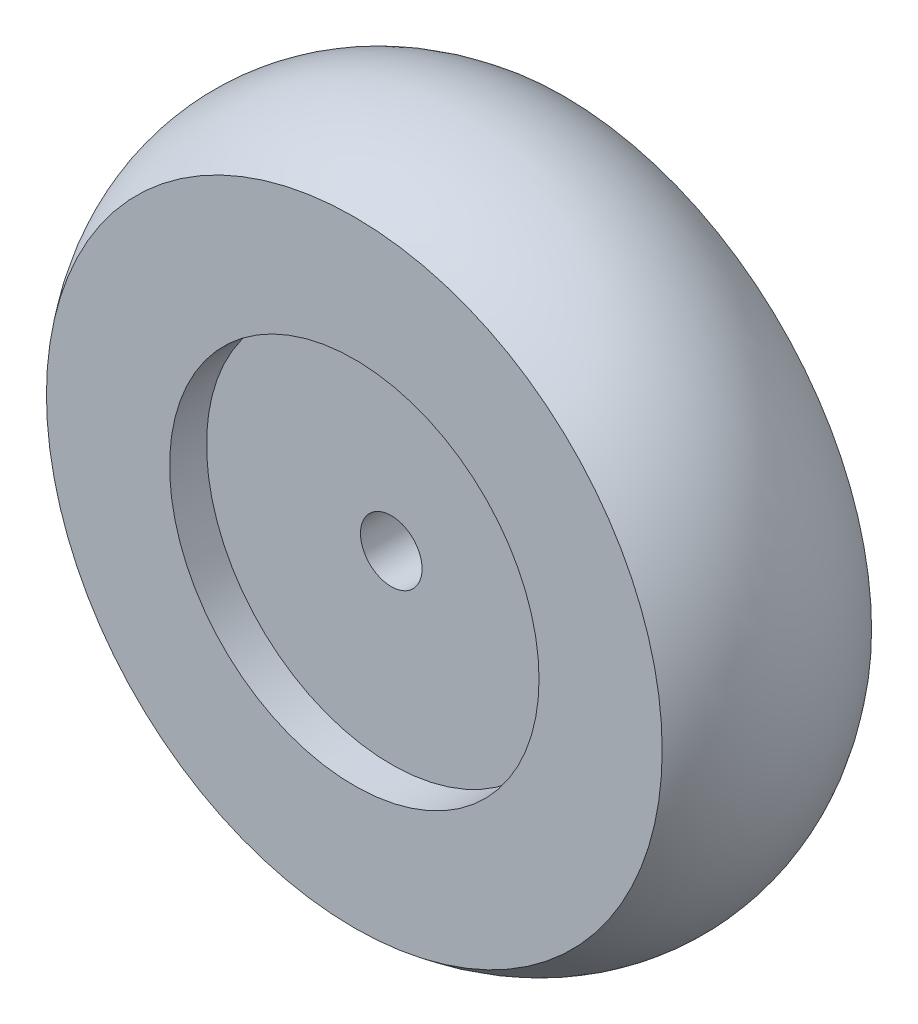
ISO-10303-21;
HEADER;
FILE_DESCRIPTION(('STEP AP214'),'2;1');
FILE_NAME('part.step','',(''),(''),'','','');
FILE_SCHEMA(('AUTOMOTIVE_DESIGN { 1 0 10303 214 1 1 1 1 }'));
ENDSEC;
DATA;
#1=APPLICATION_CONTEXT('core data for automotive mechanical design processes');
#2=APPLICATION_PROTOCOL_DEFINITION('international standard','automotive_design',2000,#1);
#3=PRODUCT_CONTEXT('',#1,'mechanical');
#4=PRODUCT('Part','Part','',(#3));
#5=PRODUCT_RELATED_PRODUCT_CATEGORY('part','',(#4));
#6=PRODUCT_DEFINITION_FORMATION('','',#4);
#7=PRODUCT_DEFINITION_CONTEXT('part definition',#1,'design');
#8=PRODUCT_DEFINITION('design','',#6,#7);
#9=PRODUCT_DEFINITION_SHAPE('','',#8);
#10=(LENGTH_UNIT() NAMED_UNIT(*) SI_UNIT(.MILLI.,.METRE.));
#11=(NAMED_UNIT(*) PLANE_ANGLE_UNIT() SI_UNIT($,.RADIAN.));
#12=(NAMED_UNIT(*) SI_UNIT($,.STERADIAN.) SOLID_ANGLE_UNIT());
#13=UNCERTAINTY_MEASURE_WITH_UNIT(LENGTH_MEASURE(1.E-05),#10,'distance_accuracy_value','');
#14=(GEOMETRIC_REPRESENTATION_CONTEXT(3) GLOBAL_UNCERTAINTY_ASSIGNED_CONTEXT((#13)) GLOBAL_UNIT_ASSIGNED_CONTEXT((#10,
#11,#12)) REPRESENTATION_CONTEXT('',''));
#15=CARTESIAN_POINT('',(0.,0.,0.));
#16=DIRECTION('',(0.,0.,1.));
#17=DIRECTION('',(1.,0.,0.));
#18=AXIS2_PLACEMENT_3D('',#15,#16,#17);
#19=CARTESIAN_POINT('',(0.,0.,17.));
#20=DIRECTION('',(0.,0.,1.));
#21=DIRECTION('',(1.,0.,0.));
#22=AXIS2_PLACEMENT_3D('',#19,#20,#21);
#23=PLANE('',#22);
#24=CARTESIAN_POINT('',(0.,0.,17.));
#25=DIRECTION('',(0.,0.,1.));
#26=DIRECTION('',(1.,0.,0.));
#27=AXIS2_PLACEMENT_3D('',#24,#25,#26);
#28=CIRCLE('',#27,15.);
#29=CARTESIAN_POINT('',(15.,0.,17.));
#30=VERTEX_POINT('',#29);
#31=EDGE_CURVE('E70',#30,#30,#28,.T.);
#32=ORIENTED_EDGE('',*,*,#31,.F.);
#33=EDGE_LOOP('',(#32));
#34=FACE_BOUND('',#33,.T.);
#35=CARTESIAN_POINT('',(0.,0.,17.));
#36=DIRECTION('',(0.,0.,1.));
#37=DIRECTION('',(1.,0.,0.));
#38=AXIS2_PLACEMENT_3D('',#35,#36,#37);
#39=CIRCLE('',#38,25.);
#40=CARTESIAN_POINT('',(25.,0.,17.));
#41=VERTEX_POINT('',#40);
#42=EDGE_CURVE('E11',#41,#41,#39,.T.);
#43=ORIENTED_EDGE('',*,*,#42,.T.);
#44=EDGE_LOOP('',(#43));
#45=FACE_BOUND('',#44,.T.);
#46=ADVANCED_FACE('F39',(#34,#45),#23,.T.);
#47=CARTESIAN_POINT('',(0.,0.,8.5));
#48=DIRECTION('',(0.,0.,1.));
#49=DIRECTION('',(1.,0.,0.));
#50=AXIS2_PLACEMENT_3D('',#47,#48,#49);
#51=TOROIDAL_SURFACE('',#50,14.6323588511587,13.4066395114938);
#52=CARTESIAN_POINT('',(14.6323588511587,0.,8.5));
#53=DIRECTION('',(0.,1.,0.));
#54=DIRECTION('',(0.,0.,-1.));
#55=AXIS2_PLACEMENT_3D('',#52,#53,#54);
#56=CIRCLE('',#55,13.4066395114938);
#57=CARTESIAN_POINT('',(25.,0.,0.));
#58=VERTEX_POINT('',#57);
#59=EDGE_CURVE('E56',#41,#58,#56,.T.);
#60=ORIENTED_EDGE('',*,*,#59,.F.);
#61=ORIENTED_EDGE('',*,*,#42,.F.);
#62=ORIENTED_EDGE('',*,*,#59,.T.);
#63=CARTESIAN_POINT('',(0.,0.,0.));
#64=DIRECTION('',(0.,0.,1.));
#65=DIRECTION('',(1.,0.,0.));
#66=AXIS2_PLACEMENT_3D('',#63,#64,#65);
#67=CIRCLE('',#66,25.);
#68=EDGE_CURVE('E48',#58,#58,#67,.T.);
#69=ORIENTED_EDGE('',*,*,#68,.T.);
#70=EDGE_LOOP('',(#60,#61,#62,#69));
#71=FACE_BOUND('',#70,.T.);
#72=ADVANCED_FACE('F98',(#71),#51,.T.);
#73=CARTESIAN_POINT('',(0.,0.,0.));
#74=DIRECTION('',(0.,0.,1.));
#75=DIRECTION('',(1.,0.,0.));
#76=AXIS2_PLACEMENT_3D('',#73,#74,#75);
#77=PLANE('',#76);
#78=CARTESIAN_POINT('',(0.,0.,0.));
#79=DIRECTION('',(0.,0.,-1.));
#80=DIRECTION('',(-1.,0.,0.));
#81=AXIS2_PLACEMENT_3D('',#78,#79,#80);
#82=CIRCLE('',#81,15.);
#83=CARTESIAN_POINT('',(-15.,0.,0.));
#84=VERTEX_POINT('',#83);
#85=EDGE_CURVE('E62',#84,#84,#82,.T.);
#86=ORIENTED_EDGE('',*,*,#85,.F.);
#87=EDGE_LOOP('',(#86));
#88=FACE_BOUND('',#87,.T.);
#89=ORIENTED_EDGE('',*,*,#68,.F.);
#90=EDGE_LOOP('',(#89));
#91=FACE_BOUND('',#90,.T.);
#92=ADVANCED_FACE('F41',(#88,#91),#77,.F.);
#93=CARTESIAN_POINT('',(0.,0.,3.));
#94=DIRECTION('',(0.,0.,-1.));
#95=DIRECTION('',(-1.,0.,0.));
#96=AXIS2_PLACEMENT_3D('',#93,#94,#95);
#97=CYLINDRICAL_SURFACE('',#96,15.);
#98=CARTESIAN_POINT('',(0.,0.,3.));
#99=DIRECTION('',(0.,0.,-1.));
#100=DIRECTION('',(-1.,0.,0.));
#101=AXIS2_PLACEMENT_3D('',#98,#99,#100);
#102=CIRCLE('',#101,15.);
#103=CARTESIAN_POINT('',(-15.,0.,3.));
#104=VERTEX_POINT('',#103);
#105=EDGE_CURVE('E60',#104,#104,#102,.T.);
#106=ORIENTED_EDGE('',*,*,#105,.F.);
#107=EDGE_LOOP('',(#106));
#108=FACE_BOUND('',#107,.T.);
#109=ORIENTED_EDGE('',*,*,#85,.T.);
#110=EDGE_LOOP('',(#109));
#111=FACE_BOUND('',#110,.T.);
#112=ADVANCED_FACE('F88',(#108,#111),#97,.F.);
#113=CARTESIAN_POINT('',(0.,0.,3.));
#114=DIRECTION('',(0.,0.,-1.));
#115=DIRECTION('',(-1.,0.,0.));
#116=AXIS2_PLACEMENT_3D('',#113,#114,#115);
#117=PLANE('',#116);
#118=CARTESIAN_POINT('',(0.,0.,3.));
#119=DIRECTION('',(0.,0.,-1.));
#120=DIRECTION('',(-1.,0.,0.));
#121=AXIS2_PLACEMENT_3D('',#118,#119,#120);
#122=CIRCLE('',#121,2.5);
#123=CARTESIAN_POINT('',(-2.5,0.,3.));
#124=VERTEX_POINT('',#123);
#125=EDGE_CURVE('E73',#124,#124,#122,.T.);
#126=ORIENTED_EDGE('',*,*,#125,.F.);
#127=EDGE_LOOP('',(#126));
#128=FACE_BOUND('',#127,.T.);
#129=ORIENTED_EDGE('',*,*,#105,.T.);
#130=EDGE_LOOP('',(#129));
#131=FACE_BOUND('',#130,.T.);
#132=ADVANCED_FACE('F84',(#128,#131),#117,.T.);
#133=CARTESIAN_POINT('',(0.,0.,14.));
#134=DIRECTION('',(0.,0.,1.));
#135=DIRECTION('',(1.,0.,0.));
#136=AXIS2_PLACEMENT_3D('',#133,#134,#135);
#137=CYLINDRICAL_SURFACE('',#136,15.);
#138=CARTESIAN_POINT('',(0.,0.,14.));
#139=DIRECTION('',(0.,0.,1.));
#140=DIRECTION('',(1.,0.,0.));
#141=AXIS2_PLACEMENT_3D('',#138,#139,#140);
#142=CIRCLE('',#141,15.);
#143=CARTESIAN_POINT('',(15.,0.,14.));
#144=VERTEX_POINT('',#143);
#145=EDGE_CURVE('E67',#144,#144,#142,.T.);
#146=ORIENTED_EDGE('',*,*,#145,.F.);
#147=EDGE_LOOP('',(#146));
#148=FACE_BOUND('',#147,.T.);
#149=ORIENTED_EDGE('',*,*,#31,.T.);
#150=EDGE_LOOP('',(#149));
#151=FACE_BOUND('',#150,.T.);
#152=ADVANCED_FACE('F87',(#148,#151),#137,.F.);
#153=CARTESIAN_POINT('',(0.,0.,14.));
#154=DIRECTION('',(0.,0.,1.));
#155=DIRECTION('',(1.,0.,0.));
#156=AXIS2_PLACEMENT_3D('',#153,#154,#155);
#157=PLANE('',#156);
#158=CARTESIAN_POINT('',(0.,0.,14.));
#159=DIRECTION('',(0.,0.,1.));
#160=DIRECTION('',(1.,0.,0.));
#161=AXIS2_PLACEMENT_3D('',#158,#159,#160);
#162=CIRCLE('',#161,2.5);
#163=CARTESIAN_POINT('',(2.5,0.,14.));
#164=VERTEX_POINT('',#163);
#165=EDGE_CURVE('E76',#164,#164,#162,.F.);
#166=ORIENTED_EDGE('',*,*,#165,.T.);
#167=EDGE_LOOP('',(#166));
#168=FACE_BOUND('',#167,.T.);
#169=ORIENTED_EDGE('',*,*,#145,.T.);
#170=EDGE_LOOP('',(#169));
#171=FACE_BOUND('',#170,.T.);
#172=ADVANCED_FACE('F112',(#168,#171),#157,.T.);
#173=CARTESIAN_POINT('',(0.,0.,17.00225));
#174=DIRECTION('',(0.,0.,-1.));
#175=DIRECTION('',(-1.,0.,0.));
#176=AXIS2_PLACEMENT_3D('',#173,#174,#175);
#177=CYLINDRICAL_SURFACE('',#176,2.5);
#178=ORIENTED_EDGE('',*,*,#165,.F.);
#179=EDGE_LOOP('',(#178));
#180=FACE_BOUND('',#179,.T.);
#181=ORIENTED_EDGE('',*,*,#125,.T.);
#182=EDGE_LOOP('',(#181));
#183=FACE_BOUND('',#182,.T.);
#184=ADVANCED_FACE('F82',(#180,#183),#177,.F.);
#185=CLOSED_SHELL('',(#46,#72,#92,#112,#132,#152,#172,#184));
#186=MANIFOLD_SOLID_BREP('B2',#185);
#187=ADVANCED_BREP_SHAPE_REPRESENTATION('',(#18,#186),#14);
#188=SHAPE_DEFINITION_REPRESENTATION(#9,#187);
ENDSEC;
END-ISO-10303-21;
